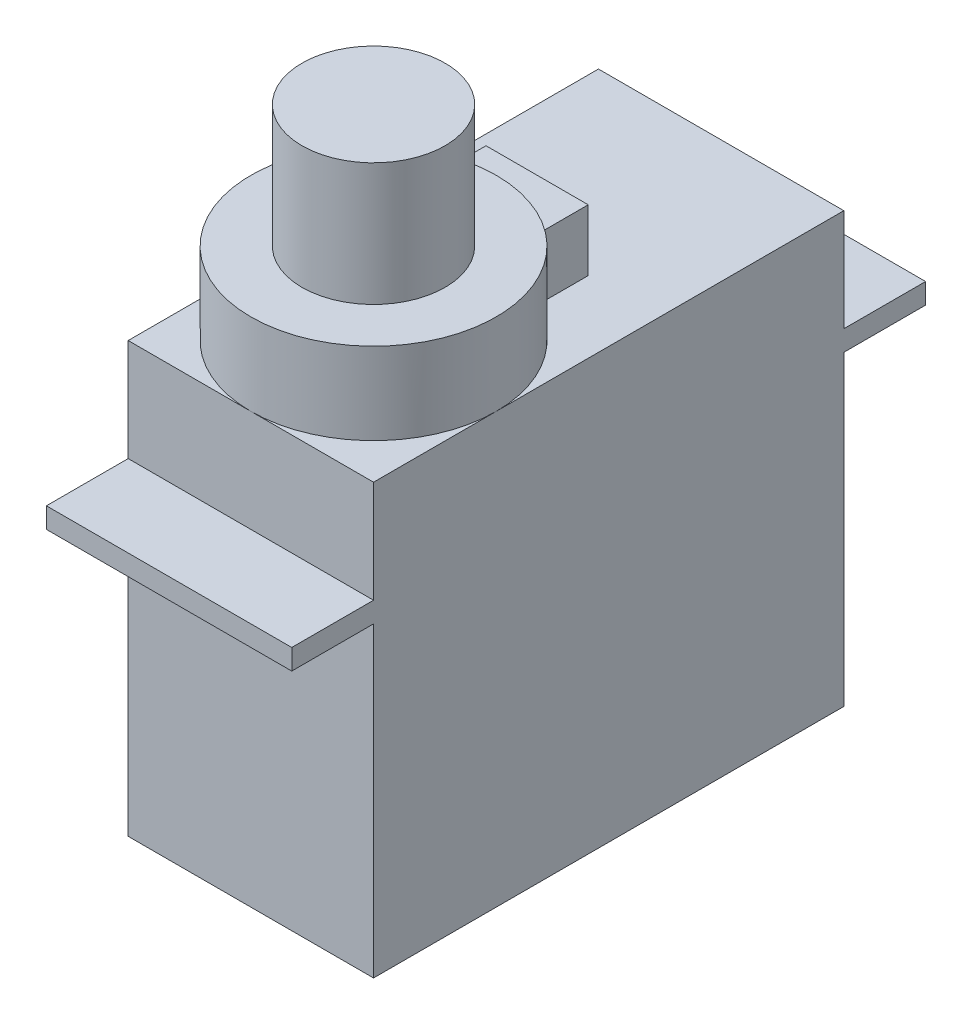
ISO-10303-21;
HEADER;
FILE_DESCRIPTION(('STEP AP214'),'2;1');
FILE_NAME('part.step','',(''),(''),'','','');
FILE_SCHEMA(('AUTOMOTIVE_DESIGN { 1 0 10303 214 1 1 1 1 }'));
ENDSEC;
DATA;
#1=APPLICATION_CONTEXT('core data for automotive mechanical design processes');
#2=APPLICATION_PROTOCOL_DEFINITION('international standard','automotive_design',2000,#1);
#3=PRODUCT_CONTEXT('',#1,'mechanical');
#4=PRODUCT('Part','Part','',(#3));
#5=PRODUCT_RELATED_PRODUCT_CATEGORY('part','',(#4));
#6=PRODUCT_DEFINITION_FORMATION('','',#4);
#7=PRODUCT_DEFINITION_CONTEXT('part definition',#1,'design');
#8=PRODUCT_DEFINITION('design','',#6,#7);
#9=PRODUCT_DEFINITION_SHAPE('','',#8);
#10=(LENGTH_UNIT() NAMED_UNIT(*) SI_UNIT(.MILLI.,.METRE.));
#11=(NAMED_UNIT(*) PLANE_ANGLE_UNIT() SI_UNIT($,.RADIAN.));
#12=(NAMED_UNIT(*) SI_UNIT($,.STERADIAN.) SOLID_ANGLE_UNIT());
#13=UNCERTAINTY_MEASURE_WITH_UNIT(LENGTH_MEASURE(1.E-05),#10,'distance_accuracy_value','');
#14=(GEOMETRIC_REPRESENTATION_CONTEXT(3) GLOBAL_UNCERTAINTY_ASSIGNED_CONTEXT((#13)) GLOBAL_UNIT_ASSIGNED_CONTEXT((#10,
#11,#12)) REPRESENTATION_CONTEXT('',''));
#15=CARTESIAN_POINT('',(0.,0.,0.));
#16=DIRECTION('',(0.,0.,1.));
#17=DIRECTION('',(1.,0.,0.));
#18=AXIS2_PLACEMENT_3D('',#15,#16,#17);
#19=CARTESIAN_POINT('',(0.,21.,0.));
#20=DIRECTION('',(0.,-1.,0.));
#21=DIRECTION('',(0.,0.,-1.));
#22=AXIS2_PLACEMENT_3D('',#19,#20,#21);
#23=PLANE('',#22);
#24=DIRECTION('',(0.,0.,-1.));
#25=VECTOR('',#24,1.);
#26=CARTESIAN_POINT('',(2.5,21.,-2.5));
#27=LINE('',#26,#25);
#28=CARTESIAN_POINT('',(2.5,21.,0.0456439426821378));
#29=VERTEX_POINT('',#28);
#30=CARTESIAN_POINT('',(2.5,21.,-2.5));
#31=VERTEX_POINT('',#30);
#32=EDGE_CURVE('E193',#29,#31,#27,.T.);
#33=ORIENTED_EDGE('',*,*,#32,.F.);
#34=CARTESIAN_POINT('',(0.,21.,5.5));
#35=DIRECTION('',(0.,1.,0.));
#36=DIRECTION('',(0.,0.,1.));
#37=AXIS2_PLACEMENT_3D('',#34,#35,#36);
#38=CIRCLE('',#37,6.00000000000001);
#39=CARTESIAN_POINT('',(6.,21.,5.5));
#40=VERTEX_POINT('',#39);
#41=EDGE_CURVE('E330',#40,#29,#38,.T.);
#42=ORIENTED_EDGE('',*,*,#41,.F.);
#43=DIRECTION('',(0.,0.,-1.));
#44=VECTOR('',#43,1.);
#45=CARTESIAN_POINT('',(6.,21.,11.5));
#46=LINE('',#45,#44);
#47=CARTESIAN_POINT('',(6.,21.,-11.5));
#48=VERTEX_POINT('',#47);
#49=EDGE_CURVE('E275',#40,#48,#46,.T.);
#50=ORIENTED_EDGE('',*,*,#49,.T.);
#51=DIRECTION('',(-1.,0.,0.));
#52=VECTOR('',#51,1.);
#53=CARTESIAN_POINT('',(-6.,21.,-11.5));
#54=LINE('',#53,#52);
#55=CARTESIAN_POINT('',(-6.,21.,-11.5));
#56=VERTEX_POINT('',#55);
#57=EDGE_CURVE('E274',#48,#56,#54,.T.);
#58=ORIENTED_EDGE('',*,*,#57,.T.);
#59=DIRECTION('',(0.,0.,1.));
#60=VECTOR('',#59,1.);
#61=CARTESIAN_POINT('',(-6.,21.,11.5));
#62=LINE('',#61,#60);
#63=CARTESIAN_POINT('',(-6.,21.,5.5));
#64=VERTEX_POINT('',#63);
#65=EDGE_CURVE('E279',#56,#64,#62,.T.);
#66=ORIENTED_EDGE('',*,*,#65,.T.);
#67=CARTESIAN_POINT('',(-2.5,21.,0.0456439426821369));
#68=VERTEX_POINT('',#67);
#69=EDGE_CURVE('E70',#68,#64,#38,.T.);
#70=ORIENTED_EDGE('',*,*,#69,.F.);
#71=DIRECTION('',(0.,0.,1.));
#72=VECTOR('',#71,1.);
#73=CARTESIAN_POINT('',(-2.5,21.,-2.5));
#74=LINE('',#73,#72);
#75=CARTESIAN_POINT('',(-2.5,21.,-2.5));
#76=VERTEX_POINT('',#75);
#77=EDGE_CURVE('E179',#76,#68,#74,.T.);
#78=ORIENTED_EDGE('',*,*,#77,.F.);
#79=DIRECTION('',(-1.,0.,0.));
#80=VECTOR('',#79,1.);
#81=CARTESIAN_POINT('',(-2.5,21.,-2.5));
#82=LINE('',#81,#80);
#83=EDGE_CURVE('E195',#31,#76,#82,.T.);
#84=ORIENTED_EDGE('',*,*,#83,.F.);
#85=EDGE_LOOP('',(#33,#42,#50,#58,#66,#70,#78,#84));
#86=FACE_BOUND('',#85,.T.);
#87=ADVANCED_FACE('F45',(#86),#23,.F.);
#88=CARTESIAN_POINT('',(0.,25.,5.5));
#89=DIRECTION('',(0.,-1.,0.));
#90=DIRECTION('',(0.,0.,-1.));
#91=AXIS2_PLACEMENT_3D('',#88,#89,#90);
#92=CYLINDRICAL_SURFACE('',#91,6.00000000000001);
#93=CARTESIAN_POINT('',(0.,25.,5.5));
#94=DIRECTION('',(0.,1.,0.));
#95=DIRECTION('',(0.,0.,1.));
#96=AXIS2_PLACEMENT_3D('',#93,#94,#95);
#97=CIRCLE('',#96,6.00000000000001);
#98=CARTESIAN_POINT('',(0.,25.,11.5));
#99=VERTEX_POINT('',#98);
#100=EDGE_CURVE('E205',#99,#99,#97,.T.);
#101=ORIENTED_EDGE('',*,*,#100,.F.);
#102=EDGE_LOOP('',(#101));
#103=FACE_BOUND('',#102,.T.);
#104=DIRECTION('',(0.,-1.,0.));
#105=VECTOR('',#104,1.);
#106=CARTESIAN_POINT('',(2.5,25.,0.0456439426821387));
#107=LINE('',#106,#105);
#108=CARTESIAN_POINT('',(2.5,24.,0.0456439426821378));
#109=VERTEX_POINT('',#108);
#110=EDGE_CURVE('E49',#109,#29,#107,.T.);
#111=ORIENTED_EDGE('',*,*,#110,.F.);
#112=CARTESIAN_POINT('',(0.,24.,5.5));
#113=DIRECTION('',(0.,1.,0.));
#114=DIRECTION('',(0.,0.,1.));
#115=AXIS2_PLACEMENT_3D('',#112,#113,#114);
#116=CIRCLE('',#115,6.00000000000001);
#117=CARTESIAN_POINT('',(-2.5,24.,0.0456439426821369));
#118=VERTEX_POINT('',#117);
#119=EDGE_CURVE('E174',#109,#118,#116,.T.);
#120=ORIENTED_EDGE('',*,*,#119,.T.);
#121=DIRECTION('',(0.,-1.,0.));
#122=VECTOR('',#121,1.);
#123=CARTESIAN_POINT('',(-2.5,25.,0.0456439426821378));
#124=LINE('',#123,#122);
#125=EDGE_CURVE('E329',#68,#118,#124,.F.);
#126=ORIENTED_EDGE('',*,*,#125,.F.);
#127=ORIENTED_EDGE('',*,*,#69,.T.);
#128=CARTESIAN_POINT('',(0.,21.,11.5));
#129=VERTEX_POINT('',#128);
#130=EDGE_CURVE('E214',#64,#129,#38,.T.);
#131=ORIENTED_EDGE('',*,*,#130,.T.);
#132=EDGE_CURVE('E210',#129,#40,#38,.T.);
#133=ORIENTED_EDGE('',*,*,#132,.T.);
#134=ORIENTED_EDGE('',*,*,#41,.T.);
#135=EDGE_LOOP('',(#111,#120,#126,#127,#131,#133,#134));
#136=FACE_BOUND('',#135,.T.);
#137=ADVANCED_FACE('F338',(#103,#136),#92,.T.);
#138=ORIENTED_EDGE('',*,*,#132,.F.);
#139=DIRECTION('',(1.,0.,0.));
#140=VECTOR('',#139,1.);
#141=CARTESIAN_POINT('',(-6.,21.,11.5));
#142=LINE('',#141,#140);
#143=CARTESIAN_POINT('',(6.,21.,11.5));
#144=VERTEX_POINT('',#143);
#145=EDGE_CURVE('E283',#129,#144,#142,.T.);
#146=ORIENTED_EDGE('',*,*,#145,.T.);
#147=EDGE_CURVE('E270',#144,#40,#46,.T.);
#148=ORIENTED_EDGE('',*,*,#147,.T.);
#149=EDGE_LOOP('',(#138,#146,#148));
#150=FACE_BOUND('',#149,.T.);
#151=ADVANCED_FACE('F419',(#150),#23,.F.);
#152=CARTESIAN_POINT('',(-6.,21.,-11.5));
#153=DIRECTION('',(0.,0.,1.));
#154=DIRECTION('',(1.,0.,0.));
#155=AXIS2_PLACEMENT_3D('',#152,#153,#154);
#156=PLANE('',#155);
#157=DIRECTION('',(0.,-1.,0.));
#158=VECTOR('',#157,1.);
#159=CARTESIAN_POINT('',(6.,21.,-11.5));
#160=LINE('',#159,#158);
#161=CARTESIAN_POINT('',(6.,16.,-11.5));
#162=VERTEX_POINT('',#161);
#163=EDGE_CURVE('E317',#48,#162,#160,.T.);
#164=ORIENTED_EDGE('',*,*,#163,.T.);
#165=DIRECTION('',(-1.,0.,0.));
#166=VECTOR('',#165,1.);
#167=CARTESIAN_POINT('',(-6.,16.,-11.5));
#168=LINE('',#167,#166);
#169=CARTESIAN_POINT('',(-6.,16.,-11.5));
#170=VERTEX_POINT('',#169);
#171=EDGE_CURVE('E265',#162,#170,#168,.T.);
#172=ORIENTED_EDGE('',*,*,#171,.T.);
#173=DIRECTION('',(0.,-1.,0.));
#174=VECTOR('',#173,1.);
#175=CARTESIAN_POINT('',(-6.,21.,-11.5));
#176=LINE('',#175,#174);
#177=EDGE_CURVE('E312',#56,#170,#176,.T.);
#178=ORIENTED_EDGE('',*,*,#177,.F.);
#179=ORIENTED_EDGE('',*,*,#57,.F.);
#180=EDGE_LOOP('',(#164,#172,#178,#179));
#181=FACE_BOUND('',#180,.T.);
#182=ADVANCED_FACE('F357',(#181),#156,.F.);
#183=CARTESIAN_POINT('',(-6.,21.,11.5));
#184=DIRECTION('',(0.,0.,-1.));
#185=DIRECTION('',(-1.,0.,0.));
#186=AXIS2_PLACEMENT_3D('',#183,#184,#185);
#187=PLANE('',#186);
#188=DIRECTION('',(0.,-1.,0.));
#189=VECTOR('',#188,1.);
#190=CARTESIAN_POINT('',(-6.,21.,11.5));
#191=LINE('',#190,#189);
#192=CARTESIAN_POINT('',(-6.,21.,11.5));
#193=VERTEX_POINT('',#192);
#194=CARTESIAN_POINT('',(-6.,16.,11.5));
#195=VERTEX_POINT('',#194);
#196=EDGE_CURVE('E308',#193,#195,#191,.T.);
#197=ORIENTED_EDGE('',*,*,#196,.T.);
#198=DIRECTION('',(1.,0.,0.));
#199=VECTOR('',#198,1.);
#200=CARTESIAN_POINT('',(-6.,16.,11.5));
#201=LINE('',#200,#199);
#202=CARTESIAN_POINT('',(6.,16.,11.5));
#203=VERTEX_POINT('',#202);
#204=EDGE_CURVE('E325',#195,#203,#201,.T.);
#205=ORIENTED_EDGE('',*,*,#204,.T.);
#206=DIRECTION('',(0.,-1.,0.));
#207=VECTOR('',#206,1.);
#208=CARTESIAN_POINT('',(6.,21.,11.5));
#209=LINE('',#208,#207);
#210=EDGE_CURVE('E303',#144,#203,#209,.T.);
#211=ORIENTED_EDGE('',*,*,#210,.F.);
#212=ORIENTED_EDGE('',*,*,#145,.F.);
#213=EDGE_CURVE('E284',#193,#129,#142,.T.);
#214=ORIENTED_EDGE('',*,*,#213,.F.);
#215=EDGE_LOOP('',(#197,#205,#211,#212,#214));
#216=FACE_BOUND('',#215,.T.);
#217=ADVANCED_FACE('F446',(#216),#187,.F.);
#218=CARTESIAN_POINT('',(6.,21.,11.5));
#219=DIRECTION('',(-1.,0.,0.));
#220=DIRECTION('',(0.,0.,1.));
#221=AXIS2_PLACEMENT_3D('',#218,#219,#220);
#222=PLANE('',#221);
#223=CARTESIAN_POINT('',(6.,15.,-11.5));
#224=VERTEX_POINT('',#223);
#225=CARTESIAN_POINT('',(6.,0.,-11.5));
#226=VERTEX_POINT('',#225);
#227=EDGE_CURVE('E316',#224,#226,#160,.T.);
#228=ORIENTED_EDGE('',*,*,#227,.F.);
#229=DIRECTION('',(0.,0.,-1.));
#230=VECTOR('',#229,1.);
#231=CARTESIAN_POINT('',(6.,15.,15.5));
#232=LINE('',#231,#230);
#233=CARTESIAN_POINT('',(6.,15.,-15.5));
#234=VERTEX_POINT('',#233);
#235=EDGE_CURVE('E231',#224,#234,#232,.T.);
#236=ORIENTED_EDGE('',*,*,#235,.T.);
#237=DIRECTION('',(0.,1.,0.));
#238=VECTOR('',#237,1.);
#239=CARTESIAN_POINT('',(6.,16.,-15.5));
#240=LINE('',#239,#238);
#241=CARTESIAN_POINT('',(6.,16.,-15.5));
#242=VERTEX_POINT('',#241);
#243=EDGE_CURVE('E236',#234,#242,#240,.T.);
#244=ORIENTED_EDGE('',*,*,#243,.T.);
#245=DIRECTION('',(0.,0.,1.));
#246=VECTOR('',#245,1.);
#247=CARTESIAN_POINT('',(6.,16.,15.5));
#248=LINE('',#247,#246);
#249=EDGE_CURVE('E241',#242,#162,#248,.T.);
#250=ORIENTED_EDGE('',*,*,#249,.T.);
#251=ORIENTED_EDGE('',*,*,#163,.F.);
#252=ORIENTED_EDGE('',*,*,#49,.F.);
#253=ORIENTED_EDGE('',*,*,#147,.F.);
#254=ORIENTED_EDGE('',*,*,#210,.T.);
#255=CARTESIAN_POINT('',(6.,16.,15.5));
#256=VERTEX_POINT('',#255);
#257=EDGE_CURVE('E240',#203,#256,#248,.T.);
#258=ORIENTED_EDGE('',*,*,#257,.T.);
#259=DIRECTION('',(0.,-1.,0.));
#260=VECTOR('',#259,1.);
#261=CARTESIAN_POINT('',(6.,16.,15.5));
#262=LINE('',#261,#260);
#263=CARTESIAN_POINT('',(6.,15.,15.5));
#264=VERTEX_POINT('',#263);
#265=EDGE_CURVE('E209',#256,#264,#262,.T.);
#266=ORIENTED_EDGE('',*,*,#265,.T.);
#267=CARTESIAN_POINT('',(6.,15.,11.5));
#268=VERTEX_POINT('',#267);
#269=EDGE_CURVE('E232',#264,#268,#232,.T.);
#270=ORIENTED_EDGE('',*,*,#269,.T.);
#271=CARTESIAN_POINT('',(6.,0.,11.5));
#272=VERTEX_POINT('',#271);
#273=EDGE_CURVE('E287',#268,#272,#209,.T.);
#274=ORIENTED_EDGE('',*,*,#273,.T.);
#275=DIRECTION('',(0.,0.,-1.));
#276=VECTOR('',#275,1.);
#277=CARTESIAN_POINT('',(6.,0.,11.5));
#278=LINE('',#277,#276);
#279=EDGE_CURVE('E269',#272,#226,#278,.T.);
#280=ORIENTED_EDGE('',*,*,#279,.T.);
#281=EDGE_LOOP('',(#228,#236,#244,#250,#251,#252,#253,#254,#258,#266,#270,#274,#280));
#282=FACE_BOUND('',#281,.T.);
#283=ADVANCED_FACE('F47',(#282),#222,.F.);
#284=CARTESIAN_POINT('',(-6.,15.,-11.5));
#285=VERTEX_POINT('',#284);
#286=CARTESIAN_POINT('',(-6.,0.,-11.5));
#287=VERTEX_POINT('',#286);
#288=EDGE_CURVE('E311',#285,#287,#176,.T.);
#289=ORIENTED_EDGE('',*,*,#288,.F.);
#290=DIRECTION('',(1.,0.,0.));
#291=VECTOR('',#290,1.);
#292=CARTESIAN_POINT('',(-6.,15.,-11.5));
#293=LINE('',#292,#291);
#294=EDGE_CURVE('E261',#285,#224,#293,.T.);
#295=ORIENTED_EDGE('',*,*,#294,.T.);
#296=ORIENTED_EDGE('',*,*,#227,.T.);
#297=DIRECTION('',(-1.,0.,0.));
#298=VECTOR('',#297,1.);
#299=CARTESIAN_POINT('',(-6.,0.,-11.5));
#300=LINE('',#299,#298);
#301=EDGE_CURVE('E291',#226,#287,#300,.T.);
#302=ORIENTED_EDGE('',*,*,#301,.T.);
#303=EDGE_LOOP('',(#289,#295,#296,#302));
#304=FACE_BOUND('',#303,.T.);
#305=ADVANCED_FACE('F381',(#304),#156,.F.);
#306=CARTESIAN_POINT('',(-6.,21.,11.5));
#307=DIRECTION('',(1.,0.,0.));
#308=DIRECTION('',(0.,0.,-1.));
#309=AXIS2_PLACEMENT_3D('',#306,#307,#308);
#310=PLANE('',#309);
#311=CARTESIAN_POINT('',(-6.,15.,11.5));
#312=VERTEX_POINT('',#311);
#313=CARTESIAN_POINT('',(-6.,0.,11.5));
#314=VERTEX_POINT('',#313);
#315=EDGE_CURVE('E307',#312,#314,#191,.T.);
#316=ORIENTED_EDGE('',*,*,#315,.F.);
#317=DIRECTION('',(0.,0.,1.));
#318=VECTOR('',#317,1.);
#319=CARTESIAN_POINT('',(-6.,15.,15.5));
#320=LINE('',#319,#318);
#321=CARTESIAN_POINT('',(-6.,15.,15.5));
#322=VERTEX_POINT('',#321);
#323=EDGE_CURVE('E227',#312,#322,#320,.T.);
#324=ORIENTED_EDGE('',*,*,#323,.T.);
#325=DIRECTION('',(0.,1.,0.));
#326=VECTOR('',#325,1.);
#327=CARTESIAN_POINT('',(-6.,16.,15.5));
#328=LINE('',#327,#326);
#329=CARTESIAN_POINT('',(-6.,16.,15.5));
#330=VERTEX_POINT('',#329);
#331=EDGE_CURVE('E224',#322,#330,#328,.T.);
#332=ORIENTED_EDGE('',*,*,#331,.T.);
#333=DIRECTION('',(0.,0.,-1.));
#334=VECTOR('',#333,1.);
#335=CARTESIAN_POINT('',(-6.,16.,15.5));
#336=LINE('',#335,#334);
#337=EDGE_CURVE('E220',#330,#195,#336,.T.);
#338=ORIENTED_EDGE('',*,*,#337,.T.);
#339=ORIENTED_EDGE('',*,*,#196,.F.);
#340=EDGE_CURVE('E278',#64,#193,#62,.T.);
#341=ORIENTED_EDGE('',*,*,#340,.F.);
#342=ORIENTED_EDGE('',*,*,#65,.F.);
#343=ORIENTED_EDGE('',*,*,#177,.T.);
#344=CARTESIAN_POINT('',(-6.,16.,-15.5));
#345=VERTEX_POINT('',#344);
#346=EDGE_CURVE('E218',#170,#345,#336,.T.);
#347=ORIENTED_EDGE('',*,*,#346,.T.);
#348=DIRECTION('',(0.,-1.,0.));
#349=VECTOR('',#348,1.);
#350=CARTESIAN_POINT('',(-6.,16.,-15.5));
#351=LINE('',#350,#349);
#352=CARTESIAN_POINT('',(-6.,15.,-15.5));
#353=VERTEX_POINT('',#352);
#354=EDGE_CURVE('E215',#345,#353,#351,.T.);
#355=ORIENTED_EDGE('',*,*,#354,.T.);
#356=EDGE_CURVE('E258',#353,#285,#320,.T.);
#357=ORIENTED_EDGE('',*,*,#356,.T.);
#358=ORIENTED_EDGE('',*,*,#288,.T.);
#359=DIRECTION('',(0.,0.,1.));
#360=VECTOR('',#359,1.);
#361=CARTESIAN_POINT('',(-6.,0.,11.5));
#362=LINE('',#361,#360);
#363=EDGE_CURVE('E295',#287,#314,#362,.T.);
#364=ORIENTED_EDGE('',*,*,#363,.T.);
#365=EDGE_LOOP('',(#316,#324,#332,#338,#339,#341,#342,#343,#347,#355,#357,#358,#364));
#366=FACE_BOUND('',#365,.T.);
#367=ADVANCED_FACE('F351',(#366),#310,.F.);
#368=ORIENTED_EDGE('',*,*,#273,.F.);
#369=DIRECTION('',(-1.,0.,0.));
#370=VECTOR('',#369,1.);
#371=CARTESIAN_POINT('',(-6.,15.,11.5));
#372=LINE('',#371,#370);
#373=EDGE_CURVE('E321',#268,#312,#372,.T.);
#374=ORIENTED_EDGE('',*,*,#373,.T.);
#375=ORIENTED_EDGE('',*,*,#315,.T.);
#376=DIRECTION('',(1.,0.,0.));
#377=VECTOR('',#376,1.);
#378=CARTESIAN_POINT('',(-6.,0.,11.5));
#379=LINE('',#378,#377);
#380=EDGE_CURVE('E299',#314,#272,#379,.T.);
#381=ORIENTED_EDGE('',*,*,#380,.T.);
#382=EDGE_LOOP('',(#368,#374,#375,#381));
#383=FACE_BOUND('',#382,.T.);
#384=ADVANCED_FACE('F386',(#383),#187,.F.);
#385=ORIENTED_EDGE('',*,*,#130,.F.);
#386=ORIENTED_EDGE('',*,*,#340,.T.);
#387=ORIENTED_EDGE('',*,*,#213,.T.);
#388=EDGE_LOOP('',(#385,#386,#387));
#389=FACE_BOUND('',#388,.T.);
#390=ADVANCED_FACE('F345',(#389),#23,.F.);
#391=CARTESIAN_POINT('',(0.,0.,0.));
#392=DIRECTION('',(0.,-1.,0.));
#393=DIRECTION('',(0.,0.,-1.));
#394=AXIS2_PLACEMENT_3D('',#391,#392,#393);
#395=PLANE('',#394);
#396=ORIENTED_EDGE('',*,*,#279,.F.);
#397=ORIENTED_EDGE('',*,*,#380,.F.);
#398=ORIENTED_EDGE('',*,*,#363,.F.);
#399=ORIENTED_EDGE('',*,*,#301,.F.);
#400=EDGE_LOOP('',(#396,#397,#398,#399));
#401=FACE_BOUND('',#400,.T.);
#402=ADVANCED_FACE('F384',(#401),#395,.T.);
#403=CARTESIAN_POINT('',(-37.0161248385416,16.,15.5));
#404=DIRECTION('',(0.,0.,1.));
#405=DIRECTION('',(1.,0.,0.));
#406=AXIS2_PLACEMENT_3D('',#403,#404,#405);
#407=PLANE('',#406);
#408=ORIENTED_EDGE('',*,*,#331,.F.);
#409=DIRECTION('',(1.,0.,0.));
#410=VECTOR('',#409,1.);
#411=CARTESIAN_POINT('',(-37.0161248385416,15.,15.5));
#412=LINE('',#411,#410);
#413=EDGE_CURVE('E245',#322,#264,#412,.T.);
#414=ORIENTED_EDGE('',*,*,#413,.T.);
#415=ORIENTED_EDGE('',*,*,#265,.F.);
#416=DIRECTION('',(1.,0.,0.));
#417=VECTOR('',#416,1.);
#418=CARTESIAN_POINT('',(-37.0161248385416,16.,15.5));
#419=LINE('',#418,#417);
#420=EDGE_CURVE('E219',#330,#256,#419,.T.);
#421=ORIENTED_EDGE('',*,*,#420,.F.);
#422=EDGE_LOOP('',(#408,#414,#415,#421));
#423=FACE_BOUND('',#422,.T.);
#424=ADVANCED_FACE('F437',(#423),#407,.T.);
#425=CARTESIAN_POINT('',(-37.0161248385416,15.,15.5));
#426=DIRECTION('',(0.,-1.,0.));
#427=DIRECTION('',(0.,0.,-1.));
#428=AXIS2_PLACEMENT_3D('',#425,#426,#427);
#429=PLANE('',#428);
#430=ORIENTED_EDGE('',*,*,#373,.F.);
#431=ORIENTED_EDGE('',*,*,#269,.F.);
#432=ORIENTED_EDGE('',*,*,#413,.F.);
#433=ORIENTED_EDGE('',*,*,#323,.F.);
#434=EDGE_LOOP('',(#430,#431,#432,#433));
#435=FACE_BOUND('',#434,.T.);
#436=ADVANCED_FACE('F436',(#435),#429,.T.);
#437=CARTESIAN_POINT('',(-37.0161248385416,16.,15.5));
#438=DIRECTION('',(0.,1.,0.));
#439=DIRECTION('',(0.,0.,1.));
#440=AXIS2_PLACEMENT_3D('',#437,#438,#439);
#441=PLANE('',#440);
#442=ORIENTED_EDGE('',*,*,#204,.F.);
#443=ORIENTED_EDGE('',*,*,#337,.F.);
#444=ORIENTED_EDGE('',*,*,#420,.T.);
#445=ORIENTED_EDGE('',*,*,#257,.F.);
#446=EDGE_LOOP('',(#442,#443,#444,#445));
#447=FACE_BOUND('',#446,.T.);
#448=ADVANCED_FACE('F431',(#447),#441,.T.);
#449=ORIENTED_EDGE('',*,*,#171,.F.);
#450=ORIENTED_EDGE('',*,*,#249,.F.);
#451=DIRECTION('',(1.,0.,0.));
#452=VECTOR('',#451,1.);
#453=CARTESIAN_POINT('',(-37.0161248385416,16.,-15.5));
#454=LINE('',#453,#452);
#455=EDGE_CURVE('E249',#345,#242,#454,.T.);
#456=ORIENTED_EDGE('',*,*,#455,.F.);
#457=ORIENTED_EDGE('',*,*,#346,.F.);
#458=EDGE_LOOP('',(#449,#450,#456,#457));
#459=FACE_BOUND('',#458,.T.);
#460=ADVANCED_FACE('F368',(#459),#441,.T.);
#461=ORIENTED_EDGE('',*,*,#294,.F.);
#462=ORIENTED_EDGE('',*,*,#356,.F.);
#463=DIRECTION('',(1.,0.,0.));
#464=VECTOR('',#463,1.);
#465=CARTESIAN_POINT('',(-37.0161248385416,15.,-15.5));
#466=LINE('',#465,#464);
#467=EDGE_CURVE('E252',#353,#234,#466,.T.);
#468=ORIENTED_EDGE('',*,*,#467,.T.);
#469=ORIENTED_EDGE('',*,*,#235,.F.);
#470=EDGE_LOOP('',(#461,#462,#468,#469));
#471=FACE_BOUND('',#470,.T.);
#472=ADVANCED_FACE('F374',(#471),#429,.T.);
#473=CARTESIAN_POINT('',(-37.0161248385416,16.,-15.5));
#474=DIRECTION('',(0.,0.,-1.));
#475=DIRECTION('',(-1.,0.,0.));
#476=AXIS2_PLACEMENT_3D('',#473,#474,#475);
#477=PLANE('',#476);
#478=ORIENTED_EDGE('',*,*,#354,.F.);
#479=ORIENTED_EDGE('',*,*,#455,.T.);
#480=ORIENTED_EDGE('',*,*,#243,.F.);
#481=ORIENTED_EDGE('',*,*,#467,.F.);
#482=EDGE_LOOP('',(#478,#479,#480,#481));
#483=FACE_BOUND('',#482,.T.);
#484=ADVANCED_FACE('F364',(#483),#477,.T.);
#485=CARTESIAN_POINT('',(0.,25.,5.5));
#486=DIRECTION('',(0.,1.,0.));
#487=DIRECTION('',(0.,0.,1.));
#488=AXIS2_PLACEMENT_3D('',#485,#486,#487);
#489=PLANE('',#488);
#490=CARTESIAN_POINT('',(0.,25.,5.5));
#491=DIRECTION('',(0.,1.,0.));
#492=DIRECTION('',(0.,0.,1.));
#493=AXIS2_PLACEMENT_3D('',#490,#491,#492);
#494=CIRCLE('',#493,3.5);
#495=CARTESIAN_POINT('',(0.,25.,9.));
#496=VERTEX_POINT('',#495);
#497=EDGE_CURVE('E12',#496,#496,#494,.T.);
#498=ORIENTED_EDGE('',*,*,#497,.F.);
#499=EDGE_LOOP('',(#498));
#500=FACE_BOUND('',#499,.T.);
#501=ORIENTED_EDGE('',*,*,#100,.T.);
#502=EDGE_LOOP('',(#501));
#503=FACE_BOUND('',#502,.T.);
#504=ADVANCED_FACE('F412',(#500,#503),#489,.T.);
#505=CARTESIAN_POINT('',(2.5,34.4339811320566,-2.5));
#506=DIRECTION('',(-1.,0.,0.));
#507=DIRECTION('',(0.,0.,1.));
#508=AXIS2_PLACEMENT_3D('',#505,#506,#507);
#509=PLANE('',#508);
#510=DIRECTION('',(0.,0.,-1.));
#511=VECTOR('',#510,1.);
#512=CARTESIAN_POINT('',(2.5,24.,-2.5));
#513=LINE('',#512,#511);
#514=CARTESIAN_POINT('',(2.5,24.,-2.5));
#515=VERTEX_POINT('',#514);
#516=EDGE_CURVE('E169',#109,#515,#513,.T.);
#517=ORIENTED_EDGE('',*,*,#516,.F.);
#518=ORIENTED_EDGE('',*,*,#110,.T.);
#519=ORIENTED_EDGE('',*,*,#32,.T.);
#520=DIRECTION('',(0.,-1.,0.));
#521=VECTOR('',#520,1.);
#522=CARTESIAN_POINT('',(2.5,34.4339811320566,-2.5));
#523=LINE('',#522,#521);
#524=EDGE_CURVE('E186',#515,#31,#523,.T.);
#525=ORIENTED_EDGE('',*,*,#524,.F.);
#526=EDGE_LOOP('',(#517,#518,#519,#525));
#527=FACE_BOUND('',#526,.T.);
#528=ADVANCED_FACE('F191',(#527),#509,.F.);
#529=CARTESIAN_POINT('',(-2.5,34.4339811320566,-2.5));
#530=DIRECTION('',(1.,0.,0.));
#531=DIRECTION('',(0.,0.,-1.));
#532=AXIS2_PLACEMENT_3D('',#529,#530,#531);
#533=PLANE('',#532);
#534=ORIENTED_EDGE('',*,*,#77,.T.);
#535=ORIENTED_EDGE('',*,*,#125,.T.);
#536=DIRECTION('',(0.,0.,1.));
#537=VECTOR('',#536,1.);
#538=CARTESIAN_POINT('',(-2.5,24.,-2.5));
#539=LINE('',#538,#537);
#540=CARTESIAN_POINT('',(-2.5,24.,-2.5));
#541=VERTEX_POINT('',#540);
#542=EDGE_CURVE('E62',#541,#118,#539,.T.);
#543=ORIENTED_EDGE('',*,*,#542,.F.);
#544=DIRECTION('',(0.,-1.,0.));
#545=VECTOR('',#544,1.);
#546=CARTESIAN_POINT('',(-2.5,34.4339811320566,-2.5));
#547=LINE('',#546,#545);
#548=EDGE_CURVE('E188',#541,#76,#547,.T.);
#549=ORIENTED_EDGE('',*,*,#548,.T.);
#550=EDGE_LOOP('',(#534,#535,#543,#549));
#551=FACE_BOUND('',#550,.T.);
#552=ADVANCED_FACE('F502',(#551),#533,.F.);
#553=CARTESIAN_POINT('',(-2.5,34.4339811320566,-2.5));
#554=DIRECTION('',(0.,0.,1.));
#555=DIRECTION('',(1.,0.,0.));
#556=AXIS2_PLACEMENT_3D('',#553,#554,#555);
#557=PLANE('',#556);
#558=DIRECTION('',(-1.,0.,0.));
#559=VECTOR('',#558,1.);
#560=CARTESIAN_POINT('',(-2.5,24.,-2.5));
#561=LINE('',#560,#559);
#562=EDGE_CURVE('E172',#515,#541,#561,.T.);
#563=ORIENTED_EDGE('',*,*,#562,.F.);
#564=ORIENTED_EDGE('',*,*,#524,.T.);
#565=ORIENTED_EDGE('',*,*,#83,.T.);
#566=ORIENTED_EDGE('',*,*,#548,.F.);
#567=EDGE_LOOP('',(#563,#564,#565,#566));
#568=FACE_BOUND('',#567,.T.);
#569=ADVANCED_FACE('F184',(#568),#557,.F.);
#570=CARTESIAN_POINT('',(0.,24.,5.5));
#571=DIRECTION('',(0.,1.,0.));
#572=DIRECTION('',(0.,0.,1.));
#573=AXIS2_PLACEMENT_3D('',#570,#571,#572);
#574=PLANE('',#573);
#575=ORIENTED_EDGE('',*,*,#119,.F.);
#576=ORIENTED_EDGE('',*,*,#516,.T.);
#577=ORIENTED_EDGE('',*,*,#562,.T.);
#578=ORIENTED_EDGE('',*,*,#542,.T.);
#579=EDGE_LOOP('',(#575,#576,#577,#578));
#580=FACE_BOUND('',#579,.T.);
#581=ADVANCED_FACE('F171',(#580),#574,.T.);
#582=CARTESIAN_POINT('',(0.,31.,5.5));
#583=DIRECTION('',(0.,-1.,0.));
#584=DIRECTION('',(0.,0.,-1.));
#585=AXIS2_PLACEMENT_3D('',#582,#583,#584);
#586=CYLINDRICAL_SURFACE('',#585,3.5);
#587=CARTESIAN_POINT('',(0.,31.,5.5));
#588=DIRECTION('',(0.,1.,0.));
#589=DIRECTION('',(0.,0.,1.));
#590=AXIS2_PLACEMENT_3D('',#587,#588,#589);
#591=CIRCLE('',#590,3.5);
#592=CARTESIAN_POINT('',(0.,31.,9.));
#593=VERTEX_POINT('',#592);
#594=EDGE_CURVE('E200',#593,#593,#591,.T.);
#595=ORIENTED_EDGE('',*,*,#594,.F.);
#596=EDGE_LOOP('',(#595));
#597=FACE_BOUND('',#596,.T.);
#598=ORIENTED_EDGE('',*,*,#497,.T.);
#599=EDGE_LOOP('',(#598));
#600=FACE_BOUND('',#599,.T.);
#601=ADVANCED_FACE('F406',(#597,#600),#586,.T.);
#602=CARTESIAN_POINT('',(0.,31.,5.5));
#603=DIRECTION('',(0.,1.,0.));
#604=DIRECTION('',(0.,0.,1.));
#605=AXIS2_PLACEMENT_3D('',#602,#603,#604);
#606=PLANE('',#605);
#607=ORIENTED_EDGE('',*,*,#594,.T.);
#608=EDGE_LOOP('',(#607));
#609=FACE_BOUND('',#608,.T.);
#610=ADVANCED_FACE('F404',(#609),#606,.T.);
#611=CLOSED_SHELL('',(#87,#137,#151,#182,#217,#283,#305,#367,#384,#390,#402,#424,#436,#448,#460,
#472,#484,#504,#528,#552,#569,#581,#601,#610));
#612=MANIFOLD_SOLID_BREP('B2',#611);
#613=ADVANCED_BREP_SHAPE_REPRESENTATION('',(#18,#612),#14);
#614=SHAPE_DEFINITION_REPRESENTATION(#9,#613);
ENDSEC;
END-ISO-10303-21;
